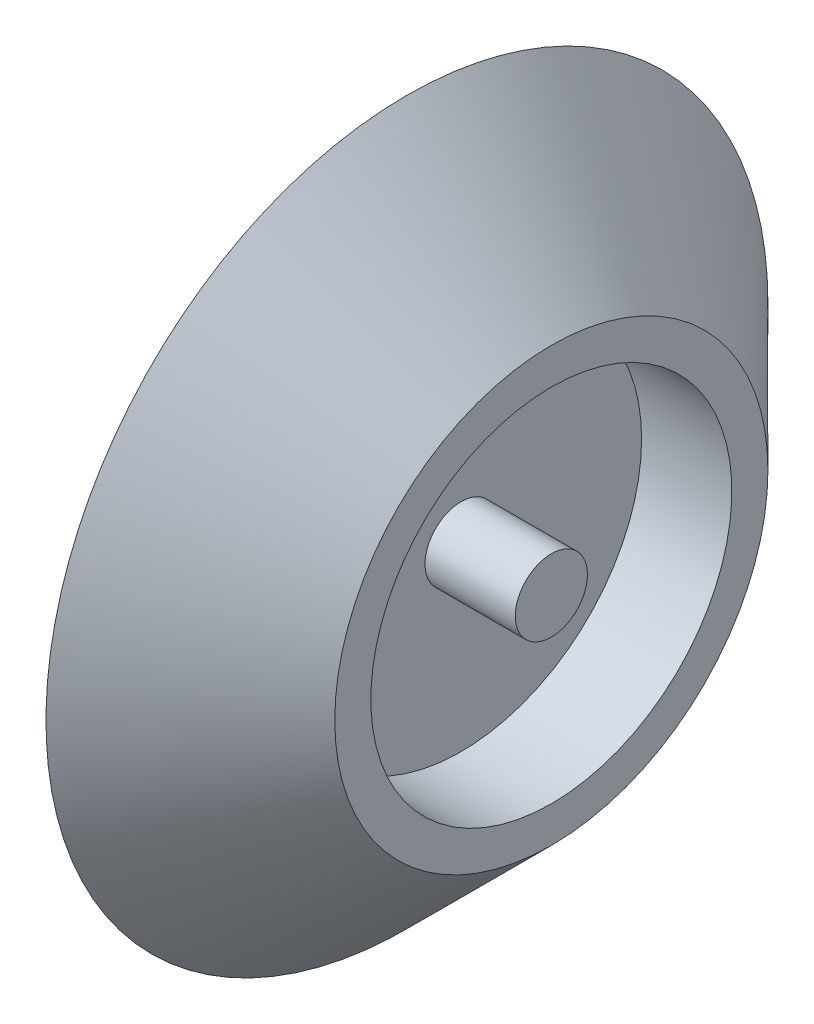
ISO-10303-21;
HEADER;
FILE_DESCRIPTION(('STEP AP214'),'2;1');
FILE_NAME('part.step','',(''),(''),'','','');
FILE_SCHEMA(('AUTOMOTIVE_DESIGN { 1 0 10303 214 1 1 1 1 }'));
ENDSEC;
DATA;
#1=APPLICATION_CONTEXT('core data for automotive mechanical design processes');
#2=APPLICATION_PROTOCOL_DEFINITION('international standard','automotive_design',2000,#1);
#3=PRODUCT_CONTEXT('',#1,'mechanical');
#4=PRODUCT('Part','Part','',(#3));
#5=PRODUCT_RELATED_PRODUCT_CATEGORY('part','',(#4));
#6=PRODUCT_DEFINITION_FORMATION('','',#4);
#7=PRODUCT_DEFINITION_CONTEXT('part definition',#1,'design');
#8=PRODUCT_DEFINITION('design','',#6,#7);
#9=PRODUCT_DEFINITION_SHAPE('','',#8);
#10=(LENGTH_UNIT() NAMED_UNIT(*) SI_UNIT(.MILLI.,.METRE.));
#11=(NAMED_UNIT(*) PLANE_ANGLE_UNIT() SI_UNIT($,.RADIAN.));
#12=(NAMED_UNIT(*) SI_UNIT($,.STERADIAN.) SOLID_ANGLE_UNIT());
#13=UNCERTAINTY_MEASURE_WITH_UNIT(LENGTH_MEASURE(1.E-05),#10,'distance_accuracy_value','');
#14=(GEOMETRIC_REPRESENTATION_CONTEXT(3) GLOBAL_UNCERTAINTY_ASSIGNED_CONTEXT((#13)) GLOBAL_UNIT_ASSIGNED_CONTEXT((#10,
#11,#12)) REPRESENTATION_CONTEXT('',''));
#15=CARTESIAN_POINT('',(0.,0.,0.));
#16=DIRECTION('',(0.,0.,1.));
#17=DIRECTION('',(1.,0.,0.));
#18=AXIS2_PLACEMENT_3D('',#15,#16,#17);
#19=CARTESIAN_POINT('',(1526.99999242226,1167.5,-542.5));
#20=DIRECTION('',(1.,0.,0.));
#21=DIRECTION('',(0.,0.,-1.));
#22=AXIS2_PLACEMENT_3D('',#19,#20,#21);
#23=PLANE('',#22);
#24=CARTESIAN_POINT('',(1526.99999242226,1167.5,-542.5));
#25=DIRECTION('',(1.,0.,0.));
#26=DIRECTION('',(0.,1.,0.));
#27=AXIS2_PLACEMENT_3D('',#24,#25,#26);
#28=CIRCLE('',#27,12.);
#29=CARTESIAN_POINT('',(1526.99999242226,1179.5,-542.5));
#30=VERTEX_POINT('',#29);
#31=EDGE_CURVE('E21',#30,#30,#28,.T.);
#32=ORIENTED_EDGE('',*,*,#31,.T.);
#33=EDGE_LOOP('',(#32));
#34=FACE_BOUND('',#33,.T.);
#35=CARTESIAN_POINT('',(1526.99999242226,1167.5,-542.5));
#36=DIRECTION('',(1.,0.,0.));
#37=DIRECTION('',(0.,1.,0.));
#38=AXIS2_PLACEMENT_3D('',#35,#36,#37);
#39=CIRCLE('',#38,10.);
#40=CARTESIAN_POINT('',(1526.99999242226,1177.5,-542.5));
#41=VERTEX_POINT('',#40);
#42=EDGE_CURVE('E30',#41,#41,#39,.F.);
#43=ORIENTED_EDGE('',*,*,#42,.T.);
#44=EDGE_LOOP('',(#43));
#45=FACE_BOUND('',#44,.T.);
#46=ADVANCED_FACE('F15',(#34,#45),#23,.T.);
#47=CARTESIAN_POINT('',(1518.99999242226,1167.5,-542.5));
#48=DIRECTION('',(1.,0.,0.));
#49=DIRECTION('',(0.,0.,-1.));
#50=AXIS2_PLACEMENT_3D('',#47,#48,#49);
#51=PLANE('',#50);
#52=CARTESIAN_POINT('',(1518.99999242226,1167.5,-542.5));
#53=DIRECTION('',(1.,0.,0.));
#54=DIRECTION('',(0.,0.,-1.));
#55=AXIS2_PLACEMENT_3D('',#52,#53,#54);
#56=CIRCLE('',#55,20.);
#57=CARTESIAN_POINT('',(1518.99999242226,1167.5,-562.5));
#58=VERTEX_POINT('',#57);
#59=EDGE_CURVE('E25',#58,#58,#56,.T.);
#60=ORIENTED_EDGE('',*,*,#59,.F.);
#61=EDGE_LOOP('',(#60));
#62=FACE_BOUND('',#61,.T.);
#63=ADVANCED_FACE('F61',(#62),#51,.F.);
#64=CARTESIAN_POINT('',(1526.99999242226,1167.5,-542.5));
#65=DIRECTION('',(-1.,0.,0.));
#66=DIRECTION('',(0.,0.,1.));
#67=AXIS2_PLACEMENT_3D('',#64,#65,#66);
#68=CONICAL_SURFACE('',#67,12.,0.785398163397448);
#69=ORIENTED_EDGE('',*,*,#59,.T.);
#70=EDGE_LOOP('',(#69));
#71=FACE_BOUND('',#70,.T.);
#72=ORIENTED_EDGE('',*,*,#31,.F.);
#73=EDGE_LOOP('',(#72));
#74=FACE_BOUND('',#73,.T.);
#75=ADVANCED_FACE('F65',(#71,#74),#68,.T.);
#76=CARTESIAN_POINT('',(1579.1314198506,1167.5,-542.5));
#77=DIRECTION('',(-1.,0.,0.));
#78=DIRECTION('',(0.,0.,1.));
#79=AXIS2_PLACEMENT_3D('',#76,#77,#78);
#80=CYLINDRICAL_SURFACE('',#79,10.);
#81=ORIENTED_EDGE('',*,*,#42,.F.);
#82=EDGE_LOOP('',(#81));
#83=FACE_BOUND('',#82,.T.);
#84=CARTESIAN_POINT('',(1521.99999242226,1167.5,-542.5));
#85=DIRECTION('',(1.,0.,0.));
#86=DIRECTION('',(0.,0.,-1.));
#87=AXIS2_PLACEMENT_3D('',#84,#85,#86);
#88=CIRCLE('',#87,10.);
#89=CARTESIAN_POINT('',(1521.99999242226,1167.5,-552.5));
#90=VERTEX_POINT('',#89);
#91=EDGE_CURVE('E34',#90,#90,#88,.T.);
#92=ORIENTED_EDGE('',*,*,#91,.F.);
#93=EDGE_LOOP('',(#92));
#94=FACE_BOUND('',#93,.T.);
#95=ADVANCED_FACE('F57',(#83,#94),#80,.F.);
#96=CARTESIAN_POINT('',(1521.99999242226,1167.5,-542.5));
#97=DIRECTION('',(1.,0.,0.));
#98=DIRECTION('',(0.,0.,-1.));
#99=AXIS2_PLACEMENT_3D('',#96,#97,#98);
#100=PLANE('',#99);
#101=CARTESIAN_POINT('',(1521.99999242226,1167.5,-542.5));
#102=DIRECTION('',(1.,0.,0.));
#103=DIRECTION('',(0.,1.,0.));
#104=AXIS2_PLACEMENT_3D('',#101,#102,#103);
#105=CIRCLE('',#104,2.);
#106=CARTESIAN_POINT('',(1521.99999242226,1169.5,-542.5));
#107=VERTEX_POINT('',#106);
#108=EDGE_CURVE('E10',#107,#107,#105,.T.);
#109=ORIENTED_EDGE('',*,*,#108,.F.);
#110=EDGE_LOOP('',(#109));
#111=FACE_BOUND('',#110,.T.);
#112=ORIENTED_EDGE('',*,*,#91,.T.);
#113=EDGE_LOOP('',(#112));
#114=FACE_BOUND('',#113,.T.);
#115=ADVANCED_FACE('F49',(#111,#114),#100,.T.);
#116=CARTESIAN_POINT('',(1469.86856499392,1167.5,-542.5));
#117=DIRECTION('',(1.,0.,0.));
#118=DIRECTION('',(0.,0.,-1.));
#119=AXIS2_PLACEMENT_3D('',#116,#117,#118);
#120=CYLINDRICAL_SURFACE('',#119,2.);
#121=ORIENTED_EDGE('',*,*,#108,.T.);
#122=EDGE_LOOP('',(#121));
#123=FACE_BOUND('',#122,.T.);
#124=CARTESIAN_POINT('',(1526.99999242226,1167.5,-542.5));
#125=DIRECTION('',(1.,0.,0.));
#126=DIRECTION('',(0.,0.,-1.));
#127=AXIS2_PLACEMENT_3D('',#124,#125,#126);
#128=CIRCLE('',#127,2.);
#129=CARTESIAN_POINT('',(1526.99999242226,1167.5,-544.5));
#130=VERTEX_POINT('',#129);
#131=EDGE_CURVE('E38',#130,#130,#128,.T.);
#132=ORIENTED_EDGE('',*,*,#131,.F.);
#133=EDGE_LOOP('',(#132));
#134=FACE_BOUND('',#133,.T.);
#135=ADVANCED_FACE('F47',(#123,#134),#120,.T.);
#136=CARTESIAN_POINT('',(1526.99999242226,1167.5,-542.5));
#137=DIRECTION('',(1.,0.,0.));
#138=DIRECTION('',(0.,0.,-1.));
#139=AXIS2_PLACEMENT_3D('',#136,#137,#138);
#140=PLANE('',#139);
#141=ORIENTED_EDGE('',*,*,#131,.T.);
#142=EDGE_LOOP('',(#141));
#143=FACE_BOUND('',#142,.T.);
#144=ADVANCED_FACE('F45',(#143),#140,.T.);
#145=CLOSED_SHELL('',(#46,#63,#75,#95,#115,#135,#144));
#146=MANIFOLD_SOLID_BREP('B1',#145);
#147=ADVANCED_BREP_SHAPE_REPRESENTATION('',(#18,#146),#14);
#148=SHAPE_DEFINITION_REPRESENTATION(#9,#147);
ENDSEC;
END-ISO-10303-21;
